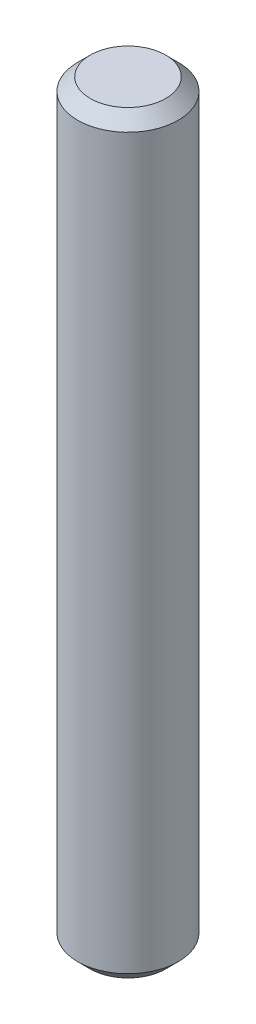
ISO-10303-21;
HEADER;
FILE_DESCRIPTION(('STEP AP214'),'2;1');
FILE_NAME('part.step','',(''),(''),'','','');
FILE_SCHEMA(('AUTOMOTIVE_DESIGN { 1 0 10303 214 1 1 1 1 }'));
ENDSEC;
DATA;
#1=APPLICATION_CONTEXT('core data for automotive mechanical design processes');
#2=APPLICATION_PROTOCOL_DEFINITION('international standard','automotive_design',2000,#1);
#3=PRODUCT_CONTEXT('',#1,'mechanical');
#4=PRODUCT('Part','Part','',(#3));
#5=PRODUCT_RELATED_PRODUCT_CATEGORY('part','',(#4));
#6=PRODUCT_DEFINITION_FORMATION('','',#4);
#7=PRODUCT_DEFINITION_CONTEXT('part definition',#1,'design');
#8=PRODUCT_DEFINITION('design','',#6,#7);
#9=PRODUCT_DEFINITION_SHAPE('','',#8);
#10=(LENGTH_UNIT() NAMED_UNIT(*) SI_UNIT(.MILLI.,.METRE.));
#11=(NAMED_UNIT(*) PLANE_ANGLE_UNIT() SI_UNIT($,.RADIAN.));
#12=(NAMED_UNIT(*) SI_UNIT($,.STERADIAN.) SOLID_ANGLE_UNIT());
#13=UNCERTAINTY_MEASURE_WITH_UNIT(LENGTH_MEASURE(1.E-05),#10,'distance_accuracy_value','');
#14=(GEOMETRIC_REPRESENTATION_CONTEXT(3) GLOBAL_UNCERTAINTY_ASSIGNED_CONTEXT((#13)) GLOBAL_UNIT_ASSIGNED_CONTEXT((#10,
#11,#12)) REPRESENTATION_CONTEXT('',''));
#15=CARTESIAN_POINT('',(0.,0.,0.));
#16=DIRECTION('',(0.,0.,1.));
#17=DIRECTION('',(1.,0.,0.));
#18=AXIS2_PLACEMENT_3D('',#15,#16,#17);
#19=CARTESIAN_POINT('',(0.,30.,0.));
#20=DIRECTION('',(0.,-1.,0.));
#21=DIRECTION('',(0.,0.,-1.));
#22=AXIS2_PLACEMENT_3D('',#19,#20,#21);
#23=CYLINDRICAL_SURFACE('',#22,2.);
#24=CARTESIAN_POINT('',(0.,0.5,0.));
#25=DIRECTION('',(0.,1.,0.));
#26=DIRECTION('',(0.,0.,1.));
#27=AXIS2_PLACEMENT_3D('',#24,#25,#26);
#28=CIRCLE('',#27,2.);
#29=CARTESIAN_POINT('',(0.,0.5,2.));
#30=VERTEX_POINT('',#29);
#31=EDGE_CURVE('E57',#30,#30,#28,.T.);
#32=ORIENTED_EDGE('',*,*,#31,.T.);
#33=EDGE_LOOP('',(#32));
#34=FACE_BOUND('',#33,.T.);
#35=CARTESIAN_POINT('',(0.,29.5,0.));
#36=DIRECTION('',(0.,1.,0.));
#37=DIRECTION('',(0.,0.,1.));
#38=AXIS2_PLACEMENT_3D('',#35,#36,#37);
#39=CIRCLE('',#38,2.);
#40=CARTESIAN_POINT('',(0.,29.5,2.));
#41=VERTEX_POINT('',#40);
#42=EDGE_CURVE('E62',#41,#41,#39,.F.);
#43=ORIENTED_EDGE('',*,*,#42,.T.);
#44=EDGE_LOOP('',(#43));
#45=FACE_BOUND('',#44,.T.);
#46=ADVANCED_FACE('F43',(#34,#45),#23,.T.);
#47=CARTESIAN_POINT('',(0.,30.,0.));
#48=DIRECTION('',(0.,1.,0.));
#49=DIRECTION('',(0.,0.,1.));
#50=AXIS2_PLACEMENT_3D('',#47,#48,#49);
#51=PLANE('',#50);
#52=CARTESIAN_POINT('',(0.,30.,0.));
#53=DIRECTION('',(0.,1.,0.));
#54=DIRECTION('',(0.,0.,1.));
#55=AXIS2_PLACEMENT_3D('',#52,#53,#54);
#56=CIRCLE('',#55,1.5);
#57=CARTESIAN_POINT('',(0.,30.,1.5));
#58=VERTEX_POINT('',#57);
#59=EDGE_CURVE('E10',#58,#58,#56,.T.);
#60=ORIENTED_EDGE('',*,*,#59,.T.);
#61=EDGE_LOOP('',(#60));
#62=FACE_BOUND('',#61,.T.);
#63=ADVANCED_FACE('F79',(#62),#51,.T.);
#64=CARTESIAN_POINT('',(0.,0.,0.));
#65=DIRECTION('',(0.,1.,0.));
#66=DIRECTION('',(0.,0.,1.));
#67=AXIS2_PLACEMENT_3D('',#64,#65,#66);
#68=PLANE('',#67);
#69=CARTESIAN_POINT('',(0.,0.,0.));
#70=DIRECTION('',(0.,1.,0.));
#71=DIRECTION('',(0.,0.,1.));
#72=AXIS2_PLACEMENT_3D('',#69,#70,#71);
#73=CIRCLE('',#72,1.5);
#74=CARTESIAN_POINT('',(0.,0.,1.5));
#75=VERTEX_POINT('',#74);
#76=EDGE_CURVE('E52',#75,#75,#73,.F.);
#77=ORIENTED_EDGE('',*,*,#76,.T.);
#78=EDGE_LOOP('',(#77));
#79=FACE_BOUND('',#78,.T.);
#80=ADVANCED_FACE('F76',(#79),#68,.F.);
#81=CARTESIAN_POINT('',(0.,0.5,0.));
#82=DIRECTION('',(0.,1.,0.));
#83=DIRECTION('',(0.,0.,1.));
#84=AXIS2_PLACEMENT_3D('',#81,#82,#83);
#85=CONICAL_SURFACE('',#84,2.,0.78539816339745);
#86=ORIENTED_EDGE('',*,*,#76,.F.);
#87=EDGE_LOOP('',(#86));
#88=FACE_BOUND('',#87,.T.);
#89=ORIENTED_EDGE('',*,*,#31,.F.);
#90=EDGE_LOOP('',(#89));
#91=FACE_BOUND('',#90,.T.);
#92=ADVANCED_FACE('F72',(#88,#91),#85,.T.);
#93=CARTESIAN_POINT('',(0.,30.,0.));
#94=DIRECTION('',(0.,-1.,0.));
#95=DIRECTION('',(0.,0.,-1.));
#96=AXIS2_PLACEMENT_3D('',#93,#94,#95);
#97=CONICAL_SURFACE('',#96,1.5,0.785398163397447);
#98=ORIENTED_EDGE('',*,*,#42,.F.);
#99=EDGE_LOOP('',(#98));
#100=FACE_BOUND('',#99,.T.);
#101=ORIENTED_EDGE('',*,*,#59,.F.);
#102=EDGE_LOOP('',(#101));
#103=FACE_BOUND('',#102,.T.);
#104=ADVANCED_FACE('F46',(#100,#103),#97,.T.);
#105=CLOSED_SHELL('',(#46,#63,#80,#92,#104));
#106=MANIFOLD_SOLID_BREP('B2',#105);
#107=ADVANCED_BREP_SHAPE_REPRESENTATION('',(#18,#106),#14);
#108=SHAPE_DEFINITION_REPRESENTATION(#9,#107);
ENDSEC;
END-ISO-10303-21;
